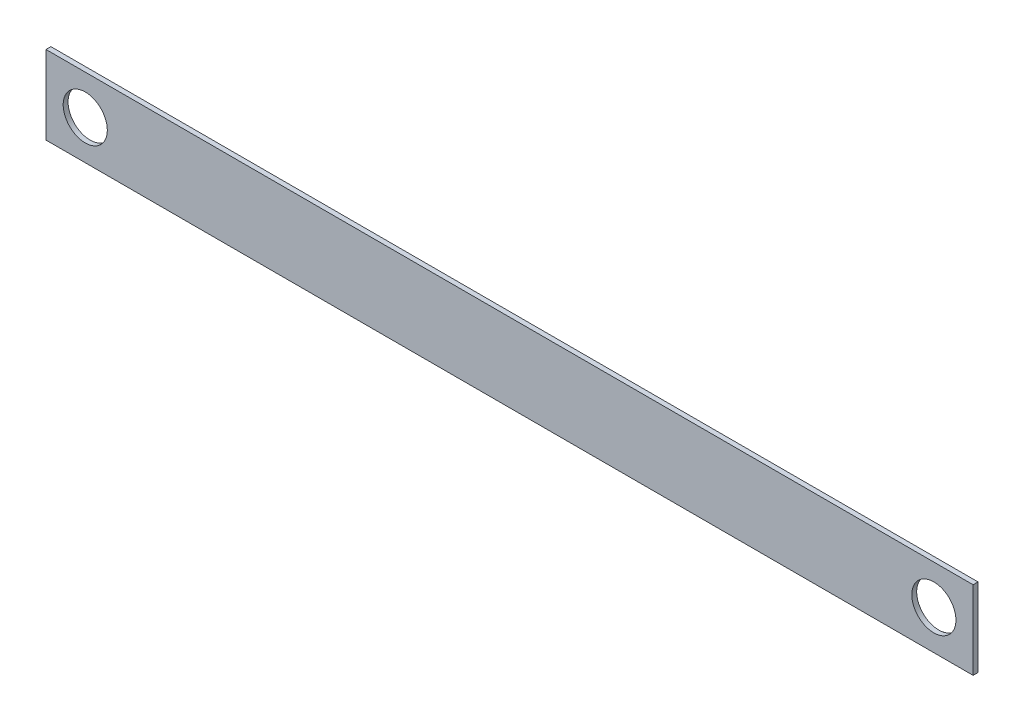
ISO-10303-21;
HEADER;
FILE_DESCRIPTION(('STEP AP214'),'2;1');
FILE_NAME('part.step','',(''),(''),'','','');
FILE_SCHEMA(('AUTOMOTIVE_DESIGN { 1 0 10303 214 1 1 1 1 }'));
ENDSEC;
DATA;
#1=APPLICATION_CONTEXT('core data for automotive mechanical design processes');
#2=APPLICATION_PROTOCOL_DEFINITION('international standard','automotive_design',2000,#1);
#3=PRODUCT_CONTEXT('',#1,'mechanical');
#4=PRODUCT('Part','Part','',(#3));
#5=PRODUCT_RELATED_PRODUCT_CATEGORY('part','',(#4));
#6=PRODUCT_DEFINITION_FORMATION('','',#4);
#7=PRODUCT_DEFINITION_CONTEXT('part definition',#1,'design');
#8=PRODUCT_DEFINITION('design','',#6,#7);
#9=PRODUCT_DEFINITION_SHAPE('','',#8);
#10=(LENGTH_UNIT() NAMED_UNIT(*) SI_UNIT(.MILLI.,.METRE.));
#11=(NAMED_UNIT(*) PLANE_ANGLE_UNIT() SI_UNIT($,.RADIAN.));
#12=(NAMED_UNIT(*) SI_UNIT($,.STERADIAN.) SOLID_ANGLE_UNIT());
#13=UNCERTAINTY_MEASURE_WITH_UNIT(LENGTH_MEASURE(1.E-05),#10,'distance_accuracy_value','');
#14=(GEOMETRIC_REPRESENTATION_CONTEXT(3) GLOBAL_UNCERTAINTY_ASSIGNED_CONTEXT((#13)) GLOBAL_UNIT_ASSIGNED_CONTEXT((#10,
#11,#12)) REPRESENTATION_CONTEXT('',''));
#15=CARTESIAN_POINT('',(0.,0.,0.));
#16=DIRECTION('',(0.,0.,1.));
#17=DIRECTION('',(1.,0.,0.));
#18=AXIS2_PLACEMENT_3D('',#15,#16,#17);
#19=CARTESIAN_POINT('',(0.,0.,3.175));
#20=DIRECTION('',(0.,0.,-1.));
#21=DIRECTION('',(-1.,0.,0.));
#22=AXIS2_PLACEMENT_3D('',#19,#20,#21);
#23=PLANE('',#22);
#24=DIRECTION('',(0.,1.,0.));
#25=VECTOR('',#24,1.);
#26=CARTESIAN_POINT('',(300.,-25.4,3.175));
#27=LINE('',#26,#25);
#28=CARTESIAN_POINT('',(300.,-25.4,3.175));
#29=VERTEX_POINT('',#28);
#30=CARTESIAN_POINT('',(300.,25.4,3.175));
#31=VERTEX_POINT('',#30);
#32=EDGE_CURVE('E92',#29,#31,#27,.T.);
#33=ORIENTED_EDGE('',*,*,#32,.T.);
#34=DIRECTION('',(-1.,0.,0.));
#35=VECTOR('',#34,1.);
#36=CARTESIAN_POINT('',(-300.,25.4,3.175));
#37=LINE('',#36,#35);
#38=CARTESIAN_POINT('',(-300.,25.4,3.175));
#39=VERTEX_POINT('',#38);
#40=EDGE_CURVE('E87',#31,#39,#37,.T.);
#41=ORIENTED_EDGE('',*,*,#40,.T.);
#42=DIRECTION('',(0.,-1.,0.));
#43=VECTOR('',#42,1.);
#44=CARTESIAN_POINT('',(-300.,-25.4,3.175));
#45=LINE('',#44,#43);
#46=CARTESIAN_POINT('',(-300.,-25.4,3.175));
#47=VERTEX_POINT('',#46);
#48=EDGE_CURVE('E90',#39,#47,#45,.T.);
#49=ORIENTED_EDGE('',*,*,#48,.T.);
#50=DIRECTION('',(1.,0.,0.));
#51=VECTOR('',#50,1.);
#52=CARTESIAN_POINT('',(-300.,-25.4,3.175));
#53=LINE('',#52,#51);
#54=EDGE_CURVE('E57',#47,#29,#53,.T.);
#55=ORIENTED_EDGE('',*,*,#54,.T.);
#56=EDGE_LOOP('',(#33,#41,#49,#55));
#57=FACE_BOUND('',#56,.T.);
#58=CARTESIAN_POINT('',(-274.6,0.,3.175));
#59=DIRECTION('',(0.,0.,1.));
#60=DIRECTION('',(1.,0.,0.));
#61=AXIS2_PLACEMENT_3D('',#58,#59,#60);
#62=CIRCLE('',#61,14.2875);
#63=CARTESIAN_POINT('',(-260.3125,0.,3.175));
#64=VERTEX_POINT('',#63);
#65=EDGE_CURVE('E112',#64,#64,#62,.T.);
#66=ORIENTED_EDGE('',*,*,#65,.F.);
#67=EDGE_LOOP('',(#66));
#68=FACE_BOUND('',#67,.T.);
#69=CARTESIAN_POINT('',(274.6,0.,3.175));
#70=DIRECTION('',(0.,0.,1.));
#71=DIRECTION('',(1.,0.,0.));
#72=AXIS2_PLACEMENT_3D('',#69,#70,#71);
#73=CIRCLE('',#72,14.2875);
#74=CARTESIAN_POINT('',(288.8875,0.,3.175));
#75=VERTEX_POINT('',#74);
#76=EDGE_CURVE('E134',#75,#75,#73,.T.);
#77=ORIENTED_EDGE('',*,*,#76,.F.);
#78=EDGE_LOOP('',(#77));
#79=FACE_BOUND('',#78,.T.);
#80=ADVANCED_FACE('F39',(#57,#68,#79),#23,.F.);
#81=CARTESIAN_POINT('',(0.,0.,0.));
#82=DIRECTION('',(0.,0.,-1.));
#83=DIRECTION('',(-1.,0.,0.));
#84=AXIS2_PLACEMENT_3D('',#81,#82,#83);
#85=PLANE('',#84);
#86=CARTESIAN_POINT('',(-274.6,0.,0.));
#87=DIRECTION('',(0.,0.,1.));
#88=DIRECTION('',(1.,0.,0.));
#89=AXIS2_PLACEMENT_3D('',#86,#87,#88);
#90=CIRCLE('',#89,14.2875);
#91=CARTESIAN_POINT('',(-260.3125,0.,0.));
#92=VERTEX_POINT('',#91);
#93=EDGE_CURVE('E130',#92,#92,#90,.T.);
#94=ORIENTED_EDGE('',*,*,#93,.T.);
#95=EDGE_LOOP('',(#94));
#96=FACE_BOUND('',#95,.T.);
#97=DIRECTION('',(0.,1.,0.));
#98=VECTOR('',#97,1.);
#99=CARTESIAN_POINT('',(300.,-25.4,0.));
#100=LINE('',#99,#98);
#101=CARTESIAN_POINT('',(300.,-25.4,0.));
#102=VERTEX_POINT('',#101);
#103=CARTESIAN_POINT('',(300.,25.4,0.));
#104=VERTEX_POINT('',#103);
#105=EDGE_CURVE('E108',#102,#104,#100,.T.);
#106=ORIENTED_EDGE('',*,*,#105,.F.);
#107=DIRECTION('',(1.,0.,0.));
#108=VECTOR('',#107,1.);
#109=CARTESIAN_POINT('',(-300.,-25.4,0.));
#110=LINE('',#109,#108);
#111=CARTESIAN_POINT('',(-300.,-25.4,0.));
#112=VERTEX_POINT('',#111);
#113=EDGE_CURVE('E80',#112,#102,#110,.T.);
#114=ORIENTED_EDGE('',*,*,#113,.F.);
#115=DIRECTION('',(0.,-1.,0.));
#116=VECTOR('',#115,1.);
#117=CARTESIAN_POINT('',(-300.,-25.4,0.));
#118=LINE('',#117,#116);
#119=CARTESIAN_POINT('',(-300.,25.4,0.));
#120=VERTEX_POINT('',#119);
#121=EDGE_CURVE('E74',#120,#112,#118,.T.);
#122=ORIENTED_EDGE('',*,*,#121,.F.);
#123=DIRECTION('',(-1.,0.,0.));
#124=VECTOR('',#123,1.);
#125=CARTESIAN_POINT('',(-300.,25.4,0.));
#126=LINE('',#125,#124);
#127=EDGE_CURVE('E97',#104,#120,#126,.T.);
#128=ORIENTED_EDGE('',*,*,#127,.F.);
#129=EDGE_LOOP('',(#106,#114,#122,#128));
#130=FACE_BOUND('',#129,.T.);
#131=CARTESIAN_POINT('',(274.6,0.,0.));
#132=DIRECTION('',(0.,0.,1.));
#133=DIRECTION('',(1.,0.,0.));
#134=AXIS2_PLACEMENT_3D('',#131,#132,#133);
#135=CIRCLE('',#134,14.2875);
#136=CARTESIAN_POINT('',(288.8875,0.,0.));
#137=VERTEX_POINT('',#136);
#138=EDGE_CURVE('E138',#137,#137,#135,.T.);
#139=ORIENTED_EDGE('',*,*,#138,.T.);
#140=EDGE_LOOP('',(#139));
#141=FACE_BOUND('',#140,.T.);
#142=ADVANCED_FACE('F125',(#96,#130,#141),#85,.T.);
#143=CARTESIAN_POINT('',(300.,-25.4,3.175));
#144=DIRECTION('',(-1.,0.,0.));
#145=DIRECTION('',(0.,0.,1.));
#146=AXIS2_PLACEMENT_3D('',#143,#144,#145);
#147=PLANE('',#146);
#148=ORIENTED_EDGE('',*,*,#105,.T.);
#149=DIRECTION('',(0.,0.,-1.));
#150=VECTOR('',#149,1.);
#151=CARTESIAN_POINT('',(300.,25.4,3.175));
#152=LINE('',#151,#150);
#153=EDGE_CURVE('E11',#31,#104,#152,.T.);
#154=ORIENTED_EDGE('',*,*,#153,.F.);
#155=ORIENTED_EDGE('',*,*,#32,.F.);
#156=DIRECTION('',(0.,0.,-1.));
#157=VECTOR('',#156,1.);
#158=CARTESIAN_POINT('',(300.,-25.4,3.175));
#159=LINE('',#158,#157);
#160=EDGE_CURVE('E104',#29,#102,#159,.T.);
#161=ORIENTED_EDGE('',*,*,#160,.T.);
#162=EDGE_LOOP('',(#148,#154,#155,#161));
#163=FACE_BOUND('',#162,.T.);
#164=ADVANCED_FACE('F41',(#163),#147,.F.);
#165=CARTESIAN_POINT('',(-300.,25.4,3.175));
#166=DIRECTION('',(0.,-1.,0.));
#167=DIRECTION('',(0.,0.,-1.));
#168=AXIS2_PLACEMENT_3D('',#165,#166,#167);
#169=PLANE('',#168);
#170=ORIENTED_EDGE('',*,*,#127,.T.);
#171=DIRECTION('',(0.,0.,-1.));
#172=VECTOR('',#171,1.);
#173=CARTESIAN_POINT('',(-300.,25.4,3.175));
#174=LINE('',#173,#172);
#175=EDGE_CURVE('E49',#39,#120,#174,.T.);
#176=ORIENTED_EDGE('',*,*,#175,.F.);
#177=ORIENTED_EDGE('',*,*,#40,.F.);
#178=ORIENTED_EDGE('',*,*,#153,.T.);
#179=EDGE_LOOP('',(#170,#176,#177,#178));
#180=FACE_BOUND('',#179,.T.);
#181=ADVANCED_FACE('F96',(#180),#169,.F.);
#182=CARTESIAN_POINT('',(-300.,-25.4,3.175));
#183=DIRECTION('',(1.,0.,0.));
#184=DIRECTION('',(0.,0.,-1.));
#185=AXIS2_PLACEMENT_3D('',#182,#183,#184);
#186=PLANE('',#185);
#187=ORIENTED_EDGE('',*,*,#121,.T.);
#188=DIRECTION('',(0.,0.,-1.));
#189=VECTOR('',#188,1.);
#190=CARTESIAN_POINT('',(-300.,-25.4,3.175));
#191=LINE('',#190,#189);
#192=EDGE_CURVE('E99',#47,#112,#191,.T.);
#193=ORIENTED_EDGE('',*,*,#192,.F.);
#194=ORIENTED_EDGE('',*,*,#48,.F.);
#195=ORIENTED_EDGE('',*,*,#175,.T.);
#196=EDGE_LOOP('',(#187,#193,#194,#195));
#197=FACE_BOUND('',#196,.T.);
#198=ADVANCED_FACE('F100',(#197),#186,.F.);
#199=CARTESIAN_POINT('',(-300.,-25.4,3.175));
#200=DIRECTION('',(0.,1.,0.));
#201=DIRECTION('',(0.,0.,1.));
#202=AXIS2_PLACEMENT_3D('',#199,#200,#201);
#203=PLANE('',#202);
#204=ORIENTED_EDGE('',*,*,#113,.T.);
#205=ORIENTED_EDGE('',*,*,#160,.F.);
#206=ORIENTED_EDGE('',*,*,#54,.F.);
#207=ORIENTED_EDGE('',*,*,#192,.T.);
#208=EDGE_LOOP('',(#204,#205,#206,#207));
#209=FACE_BOUND('',#208,.T.);
#210=ADVANCED_FACE('F122',(#209),#203,.F.);
#211=CARTESIAN_POINT('',(-274.6,0.,3.175));
#212=DIRECTION('',(0.,0.,-1.));
#213=DIRECTION('',(-1.,0.,0.));
#214=AXIS2_PLACEMENT_3D('',#211,#212,#213);
#215=CYLINDRICAL_SURFACE('',#214,14.2875);
#216=ORIENTED_EDGE('',*,*,#65,.T.);
#217=EDGE_LOOP('',(#216));
#218=FACE_BOUND('',#217,.T.);
#219=ORIENTED_EDGE('',*,*,#93,.F.);
#220=EDGE_LOOP('',(#219));
#221=FACE_BOUND('',#220,.T.);
#222=ADVANCED_FACE('F157',(#218,#221),#215,.F.);
#223=CARTESIAN_POINT('',(274.6,0.,3.175));
#224=DIRECTION('',(0.,0.,-1.));
#225=DIRECTION('',(-1.,0.,0.));
#226=AXIS2_PLACEMENT_3D('',#223,#224,#225);
#227=CYLINDRICAL_SURFACE('',#226,14.2875);
#228=ORIENTED_EDGE('',*,*,#76,.T.);
#229=EDGE_LOOP('',(#228));
#230=FACE_BOUND('',#229,.T.);
#231=ORIENTED_EDGE('',*,*,#138,.F.);
#232=EDGE_LOOP('',(#231));
#233=FACE_BOUND('',#232,.T.);
#234=ADVANCED_FACE('F146',(#230,#233),#227,.F.);
#235=CLOSED_SHELL('',(#80,#142,#164,#181,#198,#210,#222,#234));
#236=MANIFOLD_SOLID_BREP('B2',#235);
#237=ADVANCED_BREP_SHAPE_REPRESENTATION('',(#18,#236),#14);
#238=SHAPE_DEFINITION_REPRESENTATION(#9,#237);
ENDSEC;
END-ISO-10303-21;
